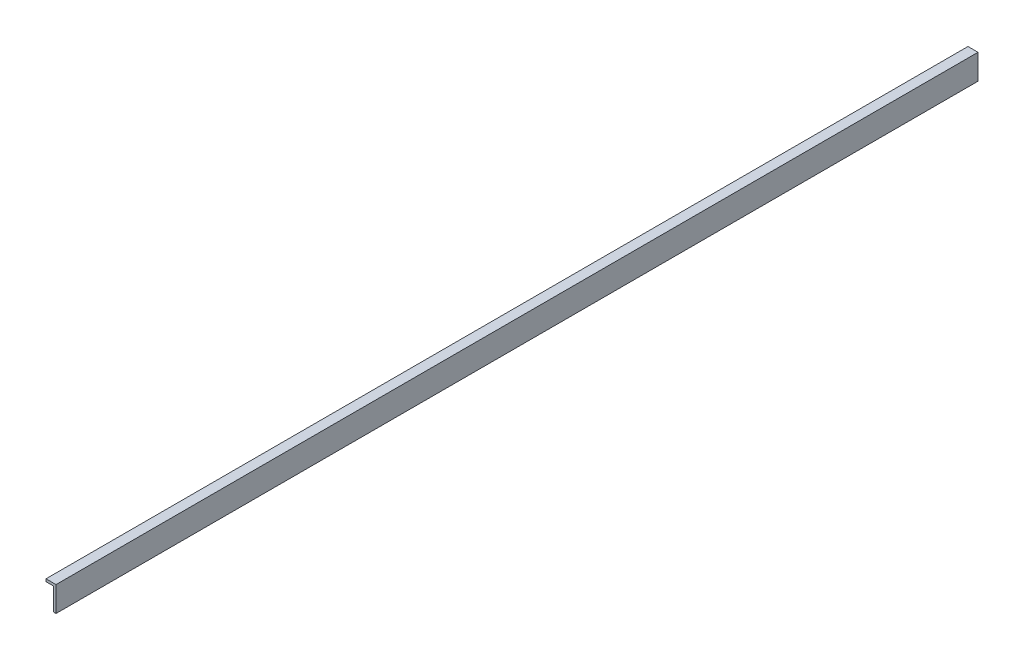
ISO-10303-21;
HEADER;
FILE_DESCRIPTION(('STEP AP214'),'2;1');
FILE_NAME('part.step','',(''),(''),'','','');
FILE_SCHEMA(('AUTOMOTIVE_DESIGN { 1 0 10303 214 1 1 1 1 }'));
ENDSEC;
DATA;
#1=APPLICATION_CONTEXT('core data for automotive mechanical design processes');
#2=APPLICATION_PROTOCOL_DEFINITION('international standard','automotive_design',2000,#1);
#3=PRODUCT_CONTEXT('',#1,'mechanical');
#4=PRODUCT('Part','Part','',(#3));
#5=PRODUCT_RELATED_PRODUCT_CATEGORY('part','',(#4));
#6=PRODUCT_DEFINITION_FORMATION('','',#4);
#7=PRODUCT_DEFINITION_CONTEXT('part definition',#1,'design');
#8=PRODUCT_DEFINITION('design','',#6,#7);
#9=PRODUCT_DEFINITION_SHAPE('','',#8);
#10=(LENGTH_UNIT() NAMED_UNIT(*) SI_UNIT(.MILLI.,.METRE.));
#11=(NAMED_UNIT(*) PLANE_ANGLE_UNIT() SI_UNIT($,.RADIAN.));
#12=(NAMED_UNIT(*) SI_UNIT($,.STERADIAN.) SOLID_ANGLE_UNIT());
#13=UNCERTAINTY_MEASURE_WITH_UNIT(LENGTH_MEASURE(1.E-05),#10,'distance_accuracy_value','');
#14=(GEOMETRIC_REPRESENTATION_CONTEXT(3) GLOBAL_UNCERTAINTY_ASSIGNED_CONTEXT((#13)) GLOBAL_UNIT_ASSIGNED_CONTEXT((#10,
#11,#12)) REPRESENTATION_CONTEXT('',''));
#15=CARTESIAN_POINT('',(0.,0.,0.));
#16=DIRECTION('',(0.,0.,1.));
#17=DIRECTION('',(1.,0.,0.));
#18=AXIS2_PLACEMENT_3D('',#15,#16,#17);
#19=CARTESIAN_POINT('',(205.5,422.5,-755.5));
#20=DIRECTION('',(-1.,0.,0.));
#21=DIRECTION('',(0.,0.,1.));
#22=AXIS2_PLACEMENT_3D('',#19,#20,#21);
#23=PLANE('',#22);
#24=DIRECTION('',(0.,-1.,0.));
#25=VECTOR('',#24,1.);
#26=CARTESIAN_POINT('',(205.5,422.5,-20.));
#27=LINE('',#26,#25);
#28=CARTESIAN_POINT('',(205.5,422.5,-20.));
#29=VERTEX_POINT('',#28);
#30=CARTESIAN_POINT('',(205.5,404.5,-20.));
#31=VERTEX_POINT('',#30);
#32=EDGE_CURVE('E124',#29,#31,#27,.T.);
#33=ORIENTED_EDGE('',*,*,#32,.F.);
#34=DIRECTION('',(0.,0.,1.));
#35=VECTOR('',#34,1.);
#36=CARTESIAN_POINT('',(205.5,422.5,-755.5));
#37=LINE('',#36,#35);
#38=CARTESIAN_POINT('',(205.5,422.5,-755.5));
#39=VERTEX_POINT('',#38);
#40=EDGE_CURVE('E11',#39,#29,#37,.T.);
#41=ORIENTED_EDGE('',*,*,#40,.F.);
#42=DIRECTION('',(0.,-1.,0.));
#43=VECTOR('',#42,1.);
#44=CARTESIAN_POINT('',(205.5,422.5,-755.5));
#45=LINE('',#44,#43);
#46=CARTESIAN_POINT('',(205.5,404.5,-755.5));
#47=VERTEX_POINT('',#46);
#48=EDGE_CURVE('E138',#39,#47,#45,.T.);
#49=ORIENTED_EDGE('',*,*,#48,.T.);
#50=DIRECTION('',(0.,0.,1.));
#51=VECTOR('',#50,1.);
#52=CARTESIAN_POINT('',(205.5,404.5,-755.5));
#53=LINE('',#52,#51);
#54=EDGE_CURVE('E42',#47,#31,#53,.T.);
#55=ORIENTED_EDGE('',*,*,#54,.T.);
#56=EDGE_LOOP('',(#33,#41,#49,#55));
#57=FACE_BOUND('',#56,.T.);
#58=ADVANCED_FACE('F39',(#57),#23,.T.);
#59=CARTESIAN_POINT('',(199.5,422.5,-755.5));
#60=DIRECTION('',(0.,-1.,0.));
#61=DIRECTION('',(0.,0.,-1.));
#62=AXIS2_PLACEMENT_3D('',#59,#60,#61);
#63=PLANE('',#62);
#64=DIRECTION('',(1.,0.,0.));
#65=VECTOR('',#64,1.);
#66=CARTESIAN_POINT('',(199.5,422.5,-20.));
#67=LINE('',#66,#65);
#68=CARTESIAN_POINT('',(199.5,422.5,-20.));
#69=VERTEX_POINT('',#68);
#70=EDGE_CURVE('E136',#69,#29,#67,.T.);
#71=ORIENTED_EDGE('',*,*,#70,.F.);
#72=DIRECTION('',(0.,0.,1.));
#73=VECTOR('',#72,1.);
#74=CARTESIAN_POINT('',(199.5,422.5,-755.5));
#75=LINE('',#74,#73);
#76=CARTESIAN_POINT('',(199.5,422.5,-755.5));
#77=VERTEX_POINT('',#76);
#78=EDGE_CURVE('E48',#77,#69,#75,.T.);
#79=ORIENTED_EDGE('',*,*,#78,.F.);
#80=DIRECTION('',(1.,0.,0.));
#81=VECTOR('',#80,1.);
#82=CARTESIAN_POINT('',(199.5,422.5,-755.5));
#83=LINE('',#82,#81);
#84=EDGE_CURVE('E114',#77,#39,#83,.T.);
#85=ORIENTED_EDGE('',*,*,#84,.T.);
#86=ORIENTED_EDGE('',*,*,#40,.T.);
#87=EDGE_LOOP('',(#71,#79,#85,#86));
#88=FACE_BOUND('',#87,.T.);
#89=ADVANCED_FACE('F146',(#88),#63,.T.);
#90=CARTESIAN_POINT('',(199.5,424.5,-755.5));
#91=DIRECTION('',(-1.,0.,0.));
#92=DIRECTION('',(0.,0.,1.));
#93=AXIS2_PLACEMENT_3D('',#90,#91,#92);
#94=PLANE('',#93);
#95=DIRECTION('',(0.,-1.,0.));
#96=VECTOR('',#95,1.);
#97=CARTESIAN_POINT('',(199.5,424.5,-20.));
#98=LINE('',#97,#96);
#99=CARTESIAN_POINT('',(199.5,424.5,-20.));
#100=VERTEX_POINT('',#99);
#101=EDGE_CURVE('E101',#100,#69,#98,.T.);
#102=ORIENTED_EDGE('',*,*,#101,.F.);
#103=DIRECTION('',(0.,0.,1.));
#104=VECTOR('',#103,1.);
#105=CARTESIAN_POINT('',(199.5,424.5,-755.5));
#106=LINE('',#105,#104);
#107=CARTESIAN_POINT('',(199.5,424.5,-755.5));
#108=VERTEX_POINT('',#107);
#109=EDGE_CURVE('E96',#108,#100,#106,.T.);
#110=ORIENTED_EDGE('',*,*,#109,.F.);
#111=DIRECTION('',(0.,-1.,0.));
#112=VECTOR('',#111,1.);
#113=CARTESIAN_POINT('',(199.5,424.5,-755.5));
#114=LINE('',#113,#112);
#115=EDGE_CURVE('E99',#108,#77,#114,.T.);
#116=ORIENTED_EDGE('',*,*,#115,.T.);
#117=ORIENTED_EDGE('',*,*,#78,.T.);
#118=EDGE_LOOP('',(#102,#110,#116,#117));
#119=FACE_BOUND('',#118,.T.);
#120=ADVANCED_FACE('F98',(#119),#94,.T.);
#121=CARTESIAN_POINT('',(207.5,424.5,-755.5));
#122=DIRECTION('',(0.,1.,0.));
#123=DIRECTION('',(0.,0.,1.));
#124=AXIS2_PLACEMENT_3D('',#121,#122,#123);
#125=PLANE('',#124);
#126=DIRECTION('',(-1.,0.,0.));
#127=VECTOR('',#126,1.);
#128=CARTESIAN_POINT('',(207.5,424.5,-20.));
#129=LINE('',#128,#127);
#130=CARTESIAN_POINT('',(207.5,424.5,-20.));
#131=VERTEX_POINT('',#130);
#132=EDGE_CURVE('E133',#131,#100,#129,.T.);
#133=ORIENTED_EDGE('',*,*,#132,.F.);
#134=DIRECTION('',(0.,0.,1.));
#135=VECTOR('',#134,1.);
#136=CARTESIAN_POINT('',(207.5,424.5,-755.5));
#137=LINE('',#136,#135);
#138=CARTESIAN_POINT('',(207.5,424.5,-755.5));
#139=VERTEX_POINT('',#138);
#140=EDGE_CURVE('E106',#139,#131,#137,.T.);
#141=ORIENTED_EDGE('',*,*,#140,.F.);
#142=DIRECTION('',(-1.,0.,0.));
#143=VECTOR('',#142,1.);
#144=CARTESIAN_POINT('',(207.5,424.5,-755.5));
#145=LINE('',#144,#143);
#146=EDGE_CURVE('E112',#139,#108,#145,.T.);
#147=ORIENTED_EDGE('',*,*,#146,.T.);
#148=ORIENTED_EDGE('',*,*,#109,.T.);
#149=EDGE_LOOP('',(#133,#141,#147,#148));
#150=FACE_BOUND('',#149,.T.);
#151=ADVANCED_FACE('F116',(#150),#125,.T.);
#152=CARTESIAN_POINT('',(207.5,404.5,-755.5));
#153=DIRECTION('',(1.,0.,0.));
#154=DIRECTION('',(0.,0.,-1.));
#155=AXIS2_PLACEMENT_3D('',#152,#153,#154);
#156=PLANE('',#155);
#157=DIRECTION('',(0.,1.,0.));
#158=VECTOR('',#157,1.);
#159=CARTESIAN_POINT('',(207.5,404.5,-20.));
#160=LINE('',#159,#158);
#161=CARTESIAN_POINT('',(207.5,404.5,-20.));
#162=VERTEX_POINT('',#161);
#163=EDGE_CURVE('E130',#162,#131,#160,.T.);
#164=ORIENTED_EDGE('',*,*,#163,.F.);
#165=DIRECTION('',(0.,0.,1.));
#166=VECTOR('',#165,1.);
#167=CARTESIAN_POINT('',(207.5,404.5,-755.5));
#168=LINE('',#167,#166);
#169=CARTESIAN_POINT('',(207.5,404.5,-755.5));
#170=VERTEX_POINT('',#169);
#171=EDGE_CURVE('E141',#170,#162,#168,.T.);
#172=ORIENTED_EDGE('',*,*,#171,.F.);
#173=DIRECTION('',(0.,1.,0.));
#174=VECTOR('',#173,1.);
#175=CARTESIAN_POINT('',(207.5,404.5,-755.5));
#176=LINE('',#175,#174);
#177=EDGE_CURVE('E117',#170,#139,#176,.T.);
#178=ORIENTED_EDGE('',*,*,#177,.T.);
#179=ORIENTED_EDGE('',*,*,#140,.T.);
#180=EDGE_LOOP('',(#164,#172,#178,#179));
#181=FACE_BOUND('',#180,.T.);
#182=ADVANCED_FACE('F159',(#181),#156,.T.);
#183=CARTESIAN_POINT('',(205.5,404.5,-755.5));
#184=DIRECTION('',(0.,-1.,0.));
#185=DIRECTION('',(0.,0.,-1.));
#186=AXIS2_PLACEMENT_3D('',#183,#184,#185);
#187=PLANE('',#186);
#188=DIRECTION('',(1.,0.,0.));
#189=VECTOR('',#188,1.);
#190=CARTESIAN_POINT('',(205.5,404.5,-20.));
#191=LINE('',#190,#189);
#192=EDGE_CURVE('E127',#31,#162,#191,.T.);
#193=ORIENTED_EDGE('',*,*,#192,.F.);
#194=ORIENTED_EDGE('',*,*,#54,.F.);
#195=DIRECTION('',(1.,0.,0.));
#196=VECTOR('',#195,1.);
#197=CARTESIAN_POINT('',(205.5,404.5,-755.5));
#198=LINE('',#197,#196);
#199=EDGE_CURVE('E119',#47,#170,#198,.T.);
#200=ORIENTED_EDGE('',*,*,#199,.T.);
#201=ORIENTED_EDGE('',*,*,#171,.T.);
#202=EDGE_LOOP('',(#193,#194,#200,#201));
#203=FACE_BOUND('',#202,.T.);
#204=ADVANCED_FACE('F143',(#203),#187,.T.);
#205=CARTESIAN_POINT('',(0.,0.,-755.5));
#206=DIRECTION('',(0.,0.,1.));
#207=DIRECTION('',(1.,0.,0.));
#208=AXIS2_PLACEMENT_3D('',#205,#206,#207);
#209=PLANE('',#208);
#210=ORIENTED_EDGE('',*,*,#48,.F.);
#211=ORIENTED_EDGE('',*,*,#84,.F.);
#212=ORIENTED_EDGE('',*,*,#115,.F.);
#213=ORIENTED_EDGE('',*,*,#146,.F.);
#214=ORIENTED_EDGE('',*,*,#177,.F.);
#215=ORIENTED_EDGE('',*,*,#199,.F.);
#216=EDGE_LOOP('',(#210,#211,#212,#213,#214,#215));
#217=FACE_BOUND('',#216,.T.);
#218=ADVANCED_FACE('F110',(#217),#209,.F.);
#219=CARTESIAN_POINT('',(0.,0.,-20.));
#220=DIRECTION('',(0.,0.,1.));
#221=DIRECTION('',(1.,0.,0.));
#222=AXIS2_PLACEMENT_3D('',#219,#220,#221);
#223=PLANE('',#222);
#224=ORIENTED_EDGE('',*,*,#32,.T.);
#225=ORIENTED_EDGE('',*,*,#192,.T.);
#226=ORIENTED_EDGE('',*,*,#163,.T.);
#227=ORIENTED_EDGE('',*,*,#132,.T.);
#228=ORIENTED_EDGE('',*,*,#101,.T.);
#229=ORIENTED_EDGE('',*,*,#70,.T.);
#230=EDGE_LOOP('',(#224,#225,#226,#227,#228,#229));
#231=FACE_BOUND('',#230,.T.);
#232=ADVANCED_FACE('F145',(#231),#223,.T.);
#233=CLOSED_SHELL('',(#58,#89,#120,#151,#182,#204,#218,#232));
#234=MANIFOLD_SOLID_BREP('B2',#233);
#235=ADVANCED_BREP_SHAPE_REPRESENTATION('',(#18,#234),#14);
#236=SHAPE_DEFINITION_REPRESENTATION(#9,#235);
ENDSEC;
END-ISO-10303-21;
